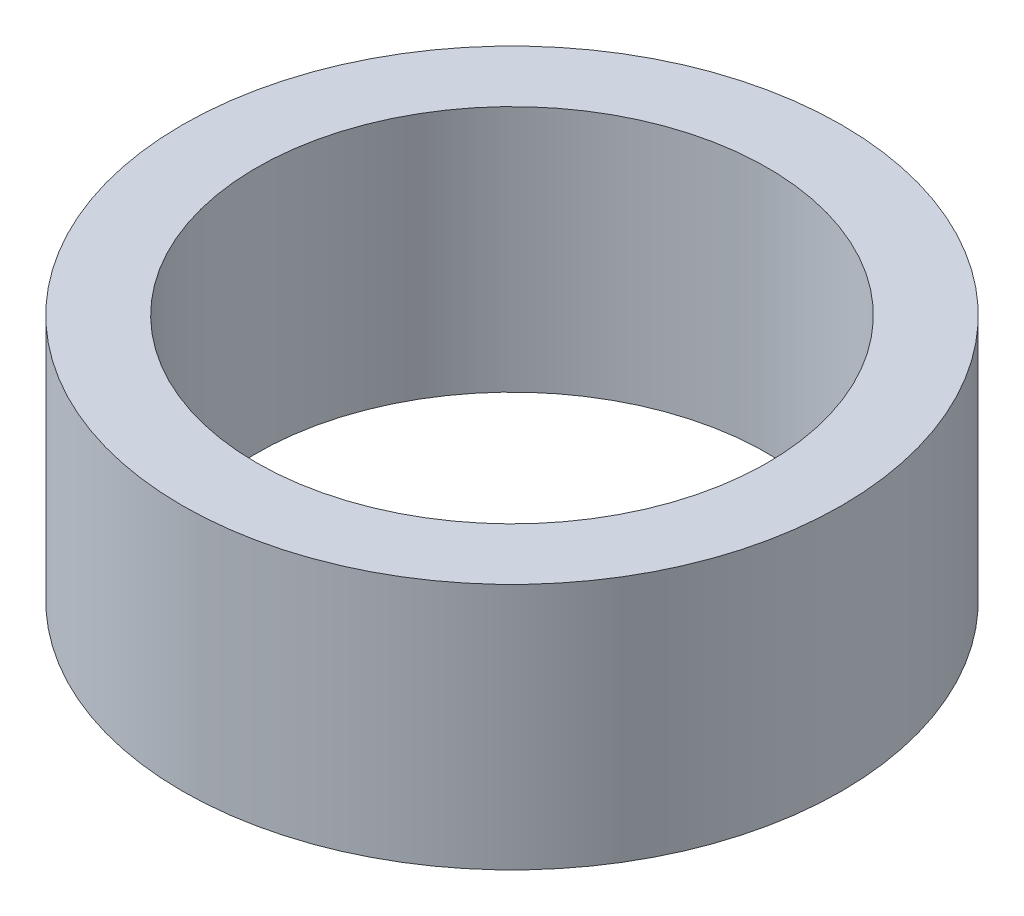
ISO-10303-21;
HEADER;
FILE_DESCRIPTION(('STEP AP214'),'2;1');
FILE_NAME('part.step','',(''),(''),'','','');
FILE_SCHEMA(('AUTOMOTIVE_DESIGN { 1 0 10303 214 1 1 1 1 }'));
ENDSEC;
DATA;
#1=APPLICATION_CONTEXT('core data for automotive mechanical design processes');
#2=APPLICATION_PROTOCOL_DEFINITION('international standard','automotive_design',2000,#1);
#3=PRODUCT_CONTEXT('',#1,'mechanical');
#4=PRODUCT('Part','Part','',(#3));
#5=PRODUCT_RELATED_PRODUCT_CATEGORY('part','',(#4));
#6=PRODUCT_DEFINITION_FORMATION('','',#4);
#7=PRODUCT_DEFINITION_CONTEXT('part definition',#1,'design');
#8=PRODUCT_DEFINITION('design','',#6,#7);
#9=PRODUCT_DEFINITION_SHAPE('','',#8);
#10=(LENGTH_UNIT() NAMED_UNIT(*) SI_UNIT(.MILLI.,.METRE.));
#11=(NAMED_UNIT(*) PLANE_ANGLE_UNIT() SI_UNIT($,.RADIAN.));
#12=(NAMED_UNIT(*) SI_UNIT($,.STERADIAN.) SOLID_ANGLE_UNIT());
#13=UNCERTAINTY_MEASURE_WITH_UNIT(LENGTH_MEASURE(1.E-05),#10,'distance_accuracy_value','');
#14=(GEOMETRIC_REPRESENTATION_CONTEXT(3) GLOBAL_UNCERTAINTY_ASSIGNED_CONTEXT((#13)) GLOBAL_UNIT_ASSIGNED_CONTEXT((#10,
#11,#12)) REPRESENTATION_CONTEXT('',''));
#15=CARTESIAN_POINT('',(0.,0.,0.));
#16=DIRECTION('',(0.,0.,1.));
#17=DIRECTION('',(1.,0.,0.));
#18=AXIS2_PLACEMENT_3D('',#15,#16,#17);
#19=CARTESIAN_POINT('',(0.,3.,0.));
#20=DIRECTION('',(0.,1.,0.));
#21=DIRECTION('',(0.,0.,1.));
#22=AXIS2_PLACEMENT_3D('',#19,#20,#21);
#23=PLANE('',#22);
#24=CARTESIAN_POINT('',(0.,3.,0.));
#25=DIRECTION('',(0.,1.,0.));
#26=DIRECTION('',(0.,0.,1.));
#27=AXIS2_PLACEMENT_3D('',#24,#25,#26);
#28=CIRCLE('',#27,4.);
#29=CARTESIAN_POINT('',(0.,3.,4.));
#30=VERTEX_POINT('',#29);
#31=EDGE_CURVE('E10',#30,#30,#28,.T.);
#32=ORIENTED_EDGE('',*,*,#31,.T.);
#33=EDGE_LOOP('',(#32));
#34=FACE_BOUND('',#33,.T.);
#35=CARTESIAN_POINT('',(0.,3.,0.));
#36=DIRECTION('',(0.,1.,0.));
#37=DIRECTION('',(0.,0.,1.));
#38=AXIS2_PLACEMENT_3D('',#35,#36,#37);
#39=CIRCLE('',#38,3.1);
#40=CARTESIAN_POINT('',(0.,3.,3.1));
#41=VERTEX_POINT('',#40);
#42=EDGE_CURVE('E42',#41,#41,#39,.T.);
#43=ORIENTED_EDGE('',*,*,#42,.F.);
#44=EDGE_LOOP('',(#43));
#45=FACE_BOUND('',#44,.T.);
#46=ADVANCED_FACE('F31',(#34,#45),#23,.T.);
#47=CARTESIAN_POINT('',(0.,0.,0.));
#48=DIRECTION('',(0.,1.,0.));
#49=DIRECTION('',(0.,0.,1.));
#50=AXIS2_PLACEMENT_3D('',#47,#48,#49);
#51=PLANE('',#50);
#52=CARTESIAN_POINT('',(0.,0.,0.));
#53=DIRECTION('',(0.,1.,0.));
#54=DIRECTION('',(0.,0.,1.));
#55=AXIS2_PLACEMENT_3D('',#52,#53,#54);
#56=CIRCLE('',#55,4.);
#57=CARTESIAN_POINT('',(0.,0.,4.));
#58=VERTEX_POINT('',#57);
#59=EDGE_CURVE('E35',#58,#58,#56,.T.);
#60=ORIENTED_EDGE('',*,*,#59,.F.);
#61=EDGE_LOOP('',(#60));
#62=FACE_BOUND('',#61,.T.);
#63=CARTESIAN_POINT('',(0.,0.,0.));
#64=DIRECTION('',(0.,1.,0.));
#65=DIRECTION('',(0.,0.,1.));
#66=AXIS2_PLACEMENT_3D('',#63,#64,#65);
#67=CIRCLE('',#66,3.1);
#68=CARTESIAN_POINT('',(0.,0.,3.1));
#69=VERTEX_POINT('',#68);
#70=EDGE_CURVE('E44',#69,#69,#67,.T.);
#71=ORIENTED_EDGE('',*,*,#70,.T.);
#72=EDGE_LOOP('',(#71));
#73=FACE_BOUND('',#72,.T.);
#74=ADVANCED_FACE('F54',(#62,#73),#51,.F.);
#75=CARTESIAN_POINT('',(0.,3.,0.));
#76=DIRECTION('',(0.,-1.,0.));
#77=DIRECTION('',(0.,0.,-1.));
#78=AXIS2_PLACEMENT_3D('',#75,#76,#77);
#79=CYLINDRICAL_SURFACE('',#78,4.);
#80=ORIENTED_EDGE('',*,*,#31,.F.);
#81=EDGE_LOOP('',(#80));
#82=FACE_BOUND('',#81,.T.);
#83=ORIENTED_EDGE('',*,*,#59,.T.);
#84=EDGE_LOOP('',(#83));
#85=FACE_BOUND('',#84,.T.);
#86=ADVANCED_FACE('F33',(#82,#85),#79,.T.);
#87=CARTESIAN_POINT('',(0.,3.,0.));
#88=DIRECTION('',(0.,-1.,0.));
#89=DIRECTION('',(0.,0.,-1.));
#90=AXIS2_PLACEMENT_3D('',#87,#88,#89);
#91=CYLINDRICAL_SURFACE('',#90,3.1);
#92=ORIENTED_EDGE('',*,*,#42,.T.);
#93=EDGE_LOOP('',(#92));
#94=FACE_BOUND('',#93,.T.);
#95=ORIENTED_EDGE('',*,*,#70,.F.);
#96=EDGE_LOOP('',(#95));
#97=FACE_BOUND('',#96,.T.);
#98=ADVANCED_FACE('F50',(#94,#97),#91,.F.);
#99=CLOSED_SHELL('',(#46,#74,#86,#98));
#100=MANIFOLD_SOLID_BREP('B2',#99);
#101=ADVANCED_BREP_SHAPE_REPRESENTATION('',(#18,#100),#14);
#102=SHAPE_DEFINITION_REPRESENTATION(#9,#101);
ENDSEC;
END-ISO-10303-21;
